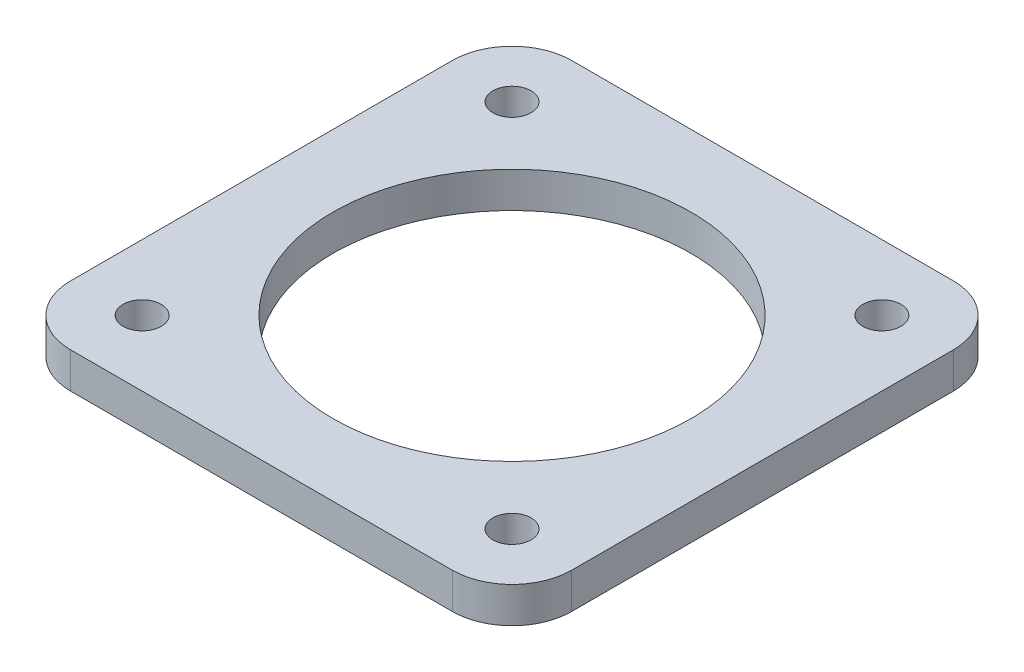
ISO-10303-21;
HEADER;
FILE_DESCRIPTION(('STEP AP214'),'2;1');
FILE_NAME('part.step','',(''),(''),'','','');
FILE_SCHEMA(('AUTOMOTIVE_DESIGN { 1 0 10303 214 1 1 1 1 }'));
ENDSEC;
DATA;
#1=APPLICATION_CONTEXT('core data for automotive mechanical design processes');
#2=APPLICATION_PROTOCOL_DEFINITION('international standard','automotive_design',2000,#1);
#3=PRODUCT_CONTEXT('',#1,'mechanical');
#4=PRODUCT('Part','Part','',(#3));
#5=PRODUCT_RELATED_PRODUCT_CATEGORY('part','',(#4));
#6=PRODUCT_DEFINITION_FORMATION('','',#4);
#7=PRODUCT_DEFINITION_CONTEXT('part definition',#1,'design');
#8=PRODUCT_DEFINITION('design','',#6,#7);
#9=PRODUCT_DEFINITION_SHAPE('','',#8);
#10=(LENGTH_UNIT() NAMED_UNIT(*) SI_UNIT(.MILLI.,.METRE.));
#11=(NAMED_UNIT(*) PLANE_ANGLE_UNIT() SI_UNIT($,.RADIAN.));
#12=(NAMED_UNIT(*) SI_UNIT($,.STERADIAN.) SOLID_ANGLE_UNIT());
#13=UNCERTAINTY_MEASURE_WITH_UNIT(LENGTH_MEASURE(1.E-05),#10,'distance_accuracy_value','');
#14=(GEOMETRIC_REPRESENTATION_CONTEXT(3) GLOBAL_UNCERTAINTY_ASSIGNED_CONTEXT((#13)) GLOBAL_UNIT_ASSIGNED_CONTEXT((#10,
#11,#12)) REPRESENTATION_CONTEXT('',''));
#15=CARTESIAN_POINT('',(0.,0.,0.));
#16=DIRECTION('',(0.,0.,1.));
#17=DIRECTION('',(1.,0.,0.));
#18=AXIS2_PLACEMENT_3D('',#15,#16,#17);
#19=CARTESIAN_POINT('',(0.,3.,21.));
#20=DIRECTION('',(0.,0.,-1.));
#21=DIRECTION('',(-1.,0.,0.));
#22=AXIS2_PLACEMENT_3D('',#19,#20,#21);
#23=PLANE('',#22);
#24=DIRECTION('',(1.,0.,0.));
#25=VECTOR('',#24,1.);
#26=CARTESIAN_POINT('',(0.,0.,21.));
#27=LINE('',#26,#25);
#28=CARTESIAN_POINT('',(-16.,0.,21.));
#29=VERTEX_POINT('',#28);
#30=CARTESIAN_POINT('',(16.,0.,21.));
#31=VERTEX_POINT('',#30);
#32=EDGE_CURVE('E189',#29,#31,#27,.T.);
#33=ORIENTED_EDGE('',*,*,#32,.T.);
#34=DIRECTION('',(0.,-1.,0.));
#35=VECTOR('',#34,1.);
#36=CARTESIAN_POINT('',(16.,3.,21.));
#37=LINE('',#36,#35);
#38=CARTESIAN_POINT('',(16.,3.,21.));
#39=VERTEX_POINT('',#38);
#40=EDGE_CURVE('E174',#31,#39,#37,.F.);
#41=ORIENTED_EDGE('',*,*,#40,.T.);
#42=DIRECTION('',(1.,0.,0.));
#43=VECTOR('',#42,1.);
#44=CARTESIAN_POINT('',(0.,3.,21.));
#45=LINE('',#44,#43);
#46=CARTESIAN_POINT('',(-16.,3.,21.));
#47=VERTEX_POINT('',#46);
#48=EDGE_CURVE('E191',#47,#39,#45,.T.);
#49=ORIENTED_EDGE('',*,*,#48,.F.);
#50=DIRECTION('',(0.,-1.,0.));
#51=VECTOR('',#50,1.);
#52=CARTESIAN_POINT('',(-16.,0.,21.));
#53=LINE('',#52,#51);
#54=EDGE_CURVE('E170',#47,#29,#53,.T.);
#55=ORIENTED_EDGE('',*,*,#54,.T.);
#56=EDGE_LOOP('',(#33,#41,#49,#55));
#57=FACE_BOUND('',#56,.T.);
#58=ADVANCED_FACE('F46',(#57),#23,.F.);
#59=CARTESIAN_POINT('',(21.,3.,0.));
#60=DIRECTION('',(-1.,0.,0.));
#61=DIRECTION('',(0.,0.,1.));
#62=AXIS2_PLACEMENT_3D('',#59,#60,#61);
#63=PLANE('',#62);
#64=DIRECTION('',(0.,0.,-1.));
#65=VECTOR('',#64,1.);
#66=CARTESIAN_POINT('',(21.,0.,0.));
#67=LINE('',#66,#65);
#68=CARTESIAN_POINT('',(21.,0.,16.));
#69=VERTEX_POINT('',#68);
#70=CARTESIAN_POINT('',(21.,0.,-16.));
#71=VERTEX_POINT('',#70);
#72=EDGE_CURVE('E132',#69,#71,#67,.T.);
#73=ORIENTED_EDGE('',*,*,#72,.T.);
#74=DIRECTION('',(0.,-1.,0.));
#75=VECTOR('',#74,1.);
#76=CARTESIAN_POINT('',(21.,3.,-16.));
#77=LINE('',#76,#75);
#78=CARTESIAN_POINT('',(21.,3.,-16.));
#79=VERTEX_POINT('',#78);
#80=EDGE_CURVE('E156',#71,#79,#77,.F.);
#81=ORIENTED_EDGE('',*,*,#80,.T.);
#82=DIRECTION('',(0.,0.,-1.));
#83=VECTOR('',#82,1.);
#84=CARTESIAN_POINT('',(21.,3.,0.));
#85=LINE('',#84,#83);
#86=CARTESIAN_POINT('',(21.,3.,16.));
#87=VERTEX_POINT('',#86);
#88=EDGE_CURVE('E218',#87,#79,#85,.T.);
#89=ORIENTED_EDGE('',*,*,#88,.F.);
#90=DIRECTION('',(0.,-1.,0.));
#91=VECTOR('',#90,1.);
#92=CARTESIAN_POINT('',(21.,3.,16.));
#93=LINE('',#92,#91);
#94=EDGE_CURVE('E152',#87,#69,#93,.T.);
#95=ORIENTED_EDGE('',*,*,#94,.T.);
#96=EDGE_LOOP('',(#73,#81,#89,#95));
#97=FACE_BOUND('',#96,.T.);
#98=ADVANCED_FACE('F281',(#97),#63,.F.);
#99=CARTESIAN_POINT('',(0.,3.,-21.));
#100=DIRECTION('',(0.,0.,-1.));
#101=DIRECTION('',(-1.,0.,0.));
#102=AXIS2_PLACEMENT_3D('',#99,#100,#101);
#103=PLANE('',#102);
#104=DIRECTION('',(1.,0.,0.));
#105=VECTOR('',#104,1.);
#106=CARTESIAN_POINT('',(0.,3.,-21.));
#107=LINE('',#106,#105);
#108=CARTESIAN_POINT('',(-16.,3.,-21.));
#109=VERTEX_POINT('',#108);
#110=CARTESIAN_POINT('',(16.,3.,-21.));
#111=VERTEX_POINT('',#110);
#112=EDGE_CURVE('E140',#109,#111,#107,.T.);
#113=ORIENTED_EDGE('',*,*,#112,.T.);
#114=DIRECTION('',(0.,-1.,0.));
#115=VECTOR('',#114,1.);
#116=CARTESIAN_POINT('',(16.,0.,-21.));
#117=LINE('',#116,#115);
#118=CARTESIAN_POINT('',(16.,0.,-21.));
#119=VERTEX_POINT('',#118);
#120=EDGE_CURVE('E123',#111,#119,#117,.T.);
#121=ORIENTED_EDGE('',*,*,#120,.T.);
#122=DIRECTION('',(1.,0.,0.));
#123=VECTOR('',#122,1.);
#124=CARTESIAN_POINT('',(0.,0.,-21.));
#125=LINE('',#124,#123);
#126=CARTESIAN_POINT('',(-16.,0.,-21.));
#127=VERTEX_POINT('',#126);
#128=EDGE_CURVE('E115',#127,#119,#125,.T.);
#129=ORIENTED_EDGE('',*,*,#128,.F.);
#130=DIRECTION('',(0.,-1.,0.));
#131=VECTOR('',#130,1.);
#132=CARTESIAN_POINT('',(-16.,3.,-21.));
#133=LINE('',#132,#131);
#134=EDGE_CURVE('E129',#127,#109,#133,.F.);
#135=ORIENTED_EDGE('',*,*,#134,.T.);
#136=EDGE_LOOP('',(#113,#121,#129,#135));
#137=FACE_BOUND('',#136,.T.);
#138=ADVANCED_FACE('F128',(#137),#103,.T.);
#139=CARTESIAN_POINT('',(-15.5,3.,-15.5));
#140=DIRECTION('',(0.,-1.,0.));
#141=DIRECTION('',(0.,0.,-1.));
#142=AXIS2_PLACEMENT_3D('',#139,#140,#141);
#143=CYLINDRICAL_SURFACE('',#142,1.6);
#144=CARTESIAN_POINT('',(-15.5,3.,-15.5));
#145=DIRECTION('',(0.,1.,0.));
#146=DIRECTION('',(0.,0.,1.));
#147=AXIS2_PLACEMENT_3D('',#144,#145,#146);
#148=CIRCLE('',#147,1.6);
#149=CARTESIAN_POINT('',(-15.5,3.,-13.9));
#150=VERTEX_POINT('',#149);
#151=EDGE_CURVE('E223',#150,#150,#148,.T.);
#152=ORIENTED_EDGE('',*,*,#151,.T.);
#153=EDGE_LOOP('',(#152));
#154=FACE_BOUND('',#153,.T.);
#155=CARTESIAN_POINT('',(-15.5,0.,-15.5));
#156=DIRECTION('',(0.,1.,0.));
#157=DIRECTION('',(0.,0.,1.));
#158=AXIS2_PLACEMENT_3D('',#155,#156,#157);
#159=CIRCLE('',#158,1.6);
#160=CARTESIAN_POINT('',(-15.5,0.,-13.9));
#161=VERTEX_POINT('',#160);
#162=EDGE_CURVE('E194',#161,#161,#159,.T.);
#163=ORIENTED_EDGE('',*,*,#162,.F.);
#164=EDGE_LOOP('',(#163));
#165=FACE_BOUND('',#164,.T.);
#166=ADVANCED_FACE('F267',(#154,#165),#143,.F.);
#167=CARTESIAN_POINT('',(-15.5000000000002,3.,15.4999999999998));
#168=DIRECTION('',(0.,-1.,0.));
#169=DIRECTION('',(0.,0.,-1.));
#170=AXIS2_PLACEMENT_3D('',#167,#168,#169);
#171=CYLINDRICAL_SURFACE('',#170,1.6);
#172=CARTESIAN_POINT('',(-15.5000000000002,3.,15.4999999999998));
#173=DIRECTION('',(0.,1.,0.));
#174=DIRECTION('',(0.,0.,1.));
#175=AXIS2_PLACEMENT_3D('',#172,#173,#174);
#176=CIRCLE('',#175,1.6);
#177=CARTESIAN_POINT('',(-15.5000000000002,3.,17.0999999999998));
#178=VERTEX_POINT('',#177);
#179=EDGE_CURVE('E227',#178,#178,#176,.T.);
#180=ORIENTED_EDGE('',*,*,#179,.T.);
#181=EDGE_LOOP('',(#180));
#182=FACE_BOUND('',#181,.T.);
#183=CARTESIAN_POINT('',(-15.5000000000002,0.,15.4999999999998));
#184=DIRECTION('',(0.,1.,0.));
#185=DIRECTION('',(0.,0.,1.));
#186=AXIS2_PLACEMENT_3D('',#183,#184,#185);
#187=CIRCLE('',#186,1.6);
#188=CARTESIAN_POINT('',(-15.5000000000002,0.,17.0999999999998));
#189=VERTEX_POINT('',#188);
#190=EDGE_CURVE('E201',#189,#189,#187,.T.);
#191=ORIENTED_EDGE('',*,*,#190,.F.);
#192=EDGE_LOOP('',(#191));
#193=FACE_BOUND('',#192,.T.);
#194=ADVANCED_FACE('F270',(#182,#193),#171,.F.);
#195=CARTESIAN_POINT('',(15.5000000000001,3.,-15.4999999999999));
#196=DIRECTION('',(0.,-1.,0.));
#197=DIRECTION('',(0.,0.,-1.));
#198=AXIS2_PLACEMENT_3D('',#195,#196,#197);
#199=CYLINDRICAL_SURFACE('',#198,1.6);
#200=CARTESIAN_POINT('',(15.5000000000001,3.,-15.4999999999999));
#201=DIRECTION('',(0.,1.,0.));
#202=DIRECTION('',(0.,0.,1.));
#203=AXIS2_PLACEMENT_3D('',#200,#201,#202);
#204=CIRCLE('',#203,1.6);
#205=CARTESIAN_POINT('',(15.5000000000001,3.,-13.8999999999999));
#206=VERTEX_POINT('',#205);
#207=EDGE_CURVE('E231',#206,#206,#204,.T.);
#208=ORIENTED_EDGE('',*,*,#207,.T.);
#209=EDGE_LOOP('',(#208));
#210=FACE_BOUND('',#209,.T.);
#211=CARTESIAN_POINT('',(15.5000000000001,0.,-15.4999999999999));
#212=DIRECTION('',(0.,1.,0.));
#213=DIRECTION('',(0.,0.,1.));
#214=AXIS2_PLACEMENT_3D('',#211,#212,#213);
#215=CIRCLE('',#214,1.6);
#216=CARTESIAN_POINT('',(15.5000000000001,0.,-13.8999999999999));
#217=VERTEX_POINT('',#216);
#218=EDGE_CURVE('E207',#217,#217,#215,.T.);
#219=ORIENTED_EDGE('',*,*,#218,.F.);
#220=EDGE_LOOP('',(#219));
#221=FACE_BOUND('',#220,.T.);
#222=ADVANCED_FACE('F292',(#210,#221),#199,.F.);
#223=CARTESIAN_POINT('',(15.4999999999999,3.,15.5000000000001));
#224=DIRECTION('',(0.,-1.,0.));
#225=DIRECTION('',(0.,0.,-1.));
#226=AXIS2_PLACEMENT_3D('',#223,#224,#225);
#227=CYLINDRICAL_SURFACE('',#226,1.6);
#228=CARTESIAN_POINT('',(15.4999999999999,3.,15.5000000000001));
#229=DIRECTION('',(0.,1.,0.));
#230=DIRECTION('',(0.,0.,1.));
#231=AXIS2_PLACEMENT_3D('',#228,#229,#230);
#232=CIRCLE('',#231,1.6);
#233=CARTESIAN_POINT('',(15.4999999999999,3.,17.1000000000001));
#234=VERTEX_POINT('',#233);
#235=EDGE_CURVE('E235',#234,#234,#232,.T.);
#236=ORIENTED_EDGE('',*,*,#235,.T.);
#237=EDGE_LOOP('',(#236));
#238=FACE_BOUND('',#237,.T.);
#239=CARTESIAN_POINT('',(15.4999999999999,0.,15.5000000000001));
#240=DIRECTION('',(0.,1.,0.));
#241=DIRECTION('',(0.,0.,1.));
#242=AXIS2_PLACEMENT_3D('',#239,#240,#241);
#243=CIRCLE('',#242,1.6);
#244=CARTESIAN_POINT('',(15.4999999999999,0.,17.1000000000001));
#245=VERTEX_POINT('',#244);
#246=EDGE_CURVE('E211',#245,#245,#243,.T.);
#247=ORIENTED_EDGE('',*,*,#246,.F.);
#248=EDGE_LOOP('',(#247));
#249=FACE_BOUND('',#248,.T.);
#250=ADVANCED_FACE('F296',(#238,#249),#227,.F.);
#251=CARTESIAN_POINT('',(-21.,3.,0.));
#252=DIRECTION('',(-1.,0.,0.));
#253=DIRECTION('',(0.,0.,1.));
#254=AXIS2_PLACEMENT_3D('',#251,#252,#253);
#255=PLANE('',#254);
#256=DIRECTION('',(0.,0.,-1.));
#257=VECTOR('',#256,1.);
#258=CARTESIAN_POINT('',(-21.,0.,0.));
#259=LINE('',#258,#257);
#260=CARTESIAN_POINT('',(-21.,0.,16.));
#261=VERTEX_POINT('',#260);
#262=CARTESIAN_POINT('',(-21.,0.,-16.));
#263=VERTEX_POINT('',#262);
#264=EDGE_CURVE('E116',#261,#263,#259,.T.);
#265=ORIENTED_EDGE('',*,*,#264,.F.);
#266=DIRECTION('',(0.,-1.,0.));
#267=VECTOR('',#266,1.);
#268=CARTESIAN_POINT('',(-21.,3.,16.));
#269=LINE('',#268,#267);
#270=CARTESIAN_POINT('',(-21.,3.,16.));
#271=VERTEX_POINT('',#270);
#272=EDGE_CURVE('E11',#261,#271,#269,.F.);
#273=ORIENTED_EDGE('',*,*,#272,.T.);
#274=DIRECTION('',(0.,0.,-1.));
#275=VECTOR('',#274,1.);
#276=CARTESIAN_POINT('',(-21.,3.,0.));
#277=LINE('',#276,#275);
#278=CARTESIAN_POINT('',(-21.,3.,-16.));
#279=VERTEX_POINT('',#278);
#280=EDGE_CURVE('E135',#271,#279,#277,.T.);
#281=ORIENTED_EDGE('',*,*,#280,.T.);
#282=DIRECTION('',(0.,-1.,0.));
#283=VECTOR('',#282,1.);
#284=CARTESIAN_POINT('',(-21.,3.,-16.));
#285=LINE('',#284,#283);
#286=EDGE_CURVE('E55',#279,#263,#285,.T.);
#287=ORIENTED_EDGE('',*,*,#286,.T.);
#288=EDGE_LOOP('',(#265,#273,#281,#287));
#289=FACE_BOUND('',#288,.T.);
#290=ADVANCED_FACE('F177',(#289),#255,.T.);
#291=CARTESIAN_POINT('',(0.,3.,0.));
#292=DIRECTION('',(0.,1.,0.));
#293=DIRECTION('',(0.,0.,1.));
#294=AXIS2_PLACEMENT_3D('',#291,#292,#293);
#295=PLANE('',#294);
#296=CARTESIAN_POINT('',(0.,3.,0.));
#297=DIRECTION('',(0.,1.,0.));
#298=DIRECTION('',(0.,0.,1.));
#299=AXIS2_PLACEMENT_3D('',#296,#297,#298);
#300=CIRCLE('',#299,15.);
#301=CARTESIAN_POINT('',(0.,3.,15.));
#302=VERTEX_POINT('',#301);
#303=EDGE_CURVE('E239',#302,#302,#300,.T.);
#304=ORIENTED_EDGE('',*,*,#303,.F.);
#305=EDGE_LOOP('',(#304));
#306=FACE_BOUND('',#305,.T.);
#307=ORIENTED_EDGE('',*,*,#235,.F.);
#308=EDGE_LOOP('',(#307));
#309=FACE_BOUND('',#308,.T.);
#310=ORIENTED_EDGE('',*,*,#207,.F.);
#311=EDGE_LOOP('',(#310));
#312=FACE_BOUND('',#311,.T.);
#313=ORIENTED_EDGE('',*,*,#179,.F.);
#314=EDGE_LOOP('',(#313));
#315=FACE_BOUND('',#314,.T.);
#316=ORIENTED_EDGE('',*,*,#151,.F.);
#317=EDGE_LOOP('',(#316));
#318=FACE_BOUND('',#317,.T.);
#319=ORIENTED_EDGE('',*,*,#88,.T.);
#320=CARTESIAN_POINT('',(16.,3.,-16.));
#321=DIRECTION('',(0.,1.,0.));
#322=DIRECTION('',(0.,0.,1.));
#323=AXIS2_PLACEMENT_3D('',#320,#321,#322);
#324=CIRCLE('',#323,5.);
#325=EDGE_CURVE('E167',#79,#111,#324,.T.);
#326=ORIENTED_EDGE('',*,*,#325,.T.);
#327=ORIENTED_EDGE('',*,*,#112,.F.);
#328=CARTESIAN_POINT('',(-16.,3.,-16.));
#329=DIRECTION('',(0.,1.,0.));
#330=DIRECTION('',(0.,0.,1.));
#331=AXIS2_PLACEMENT_3D('',#328,#329,#330);
#332=CIRCLE('',#331,5.);
#333=EDGE_CURVE('E62',#109,#279,#332,.T.);
#334=ORIENTED_EDGE('',*,*,#333,.T.);
#335=ORIENTED_EDGE('',*,*,#280,.F.);
#336=CARTESIAN_POINT('',(-16.,3.,16.));
#337=DIRECTION('',(0.,1.,0.));
#338=DIRECTION('',(0.,0.,1.));
#339=AXIS2_PLACEMENT_3D('',#336,#337,#338);
#340=CIRCLE('',#339,5.);
#341=EDGE_CURVE('E161',#271,#47,#340,.T.);
#342=ORIENTED_EDGE('',*,*,#341,.T.);
#343=ORIENTED_EDGE('',*,*,#48,.T.);
#344=CARTESIAN_POINT('',(16.,3.,16.));
#345=DIRECTION('',(0.,1.,0.));
#346=DIRECTION('',(0.,0.,1.));
#347=AXIS2_PLACEMENT_3D('',#344,#345,#346);
#348=CIRCLE('',#347,5.);
#349=EDGE_CURVE('E164',#39,#87,#348,.T.);
#350=ORIENTED_EDGE('',*,*,#349,.T.);
#351=EDGE_LOOP('',(#319,#326,#327,#334,#335,#342,#343,#350));
#352=FACE_BOUND('',#351,.T.);
#353=ADVANCED_FACE('F180',(#306,#309,#312,#315,#318,#352),#295,.T.);
#354=CARTESIAN_POINT('',(0.,0.,0.));
#355=DIRECTION('',(0.,1.,0.));
#356=DIRECTION('',(0.,0.,1.));
#357=AXIS2_PLACEMENT_3D('',#354,#355,#356);
#358=PLANE('',#357);
#359=CARTESIAN_POINT('',(0.,0.,0.));
#360=DIRECTION('',(0.,1.,0.));
#361=DIRECTION('',(0.,0.,1.));
#362=AXIS2_PLACEMENT_3D('',#359,#360,#361);
#363=CIRCLE('',#362,15.);
#364=CARTESIAN_POINT('',(0.,0.,15.));
#365=VERTEX_POINT('',#364);
#366=EDGE_CURVE('E214',#365,#365,#363,.T.);
#367=ORIENTED_EDGE('',*,*,#366,.T.);
#368=EDGE_LOOP('',(#367));
#369=FACE_BOUND('',#368,.T.);
#370=ORIENTED_EDGE('',*,*,#246,.T.);
#371=EDGE_LOOP('',(#370));
#372=FACE_BOUND('',#371,.T.);
#373=ORIENTED_EDGE('',*,*,#218,.T.);
#374=EDGE_LOOP('',(#373));
#375=FACE_BOUND('',#374,.T.);
#376=ORIENTED_EDGE('',*,*,#190,.T.);
#377=EDGE_LOOP('',(#376));
#378=FACE_BOUND('',#377,.T.);
#379=ORIENTED_EDGE('',*,*,#162,.T.);
#380=EDGE_LOOP('',(#379));
#381=FACE_BOUND('',#380,.T.);
#382=ORIENTED_EDGE('',*,*,#128,.T.);
#383=CARTESIAN_POINT('',(16.,0.,-16.));
#384=DIRECTION('',(0.,1.,0.));
#385=DIRECTION('',(0.,0.,1.));
#386=AXIS2_PLACEMENT_3D('',#383,#384,#385);
#387=CIRCLE('',#386,5.);
#388=EDGE_CURVE('E149',#119,#71,#387,.F.);
#389=ORIENTED_EDGE('',*,*,#388,.T.);
#390=ORIENTED_EDGE('',*,*,#72,.F.);
#391=CARTESIAN_POINT('',(16.,0.,16.));
#392=DIRECTION('',(0.,1.,0.));
#393=DIRECTION('',(0.,0.,1.));
#394=AXIS2_PLACEMENT_3D('',#391,#392,#393);
#395=CIRCLE('',#394,5.);
#396=EDGE_CURVE('E146',#69,#31,#395,.F.);
#397=ORIENTED_EDGE('',*,*,#396,.T.);
#398=ORIENTED_EDGE('',*,*,#32,.F.);
#399=CARTESIAN_POINT('',(-16.,0.,16.));
#400=DIRECTION('',(0.,1.,0.));
#401=DIRECTION('',(0.,0.,1.));
#402=AXIS2_PLACEMENT_3D('',#399,#400,#401);
#403=CIRCLE('',#402,5.);
#404=EDGE_CURVE('E122',#29,#261,#403,.F.);
#405=ORIENTED_EDGE('',*,*,#404,.T.);
#406=ORIENTED_EDGE('',*,*,#264,.T.);
#407=CARTESIAN_POINT('',(-16.,0.,-16.));
#408=DIRECTION('',(0.,1.,0.));
#409=DIRECTION('',(0.,0.,1.));
#410=AXIS2_PLACEMENT_3D('',#407,#408,#409);
#411=CIRCLE('',#410,5.);
#412=EDGE_CURVE('E112',#263,#127,#411,.F.);
#413=ORIENTED_EDGE('',*,*,#412,.T.);
#414=EDGE_LOOP('',(#382,#389,#390,#397,#398,#405,#406,#413));
#415=FACE_BOUND('',#414,.T.);
#416=ADVANCED_FACE('F114',(#369,#372,#375,#378,#381,#415),#358,.F.);
#417=CARTESIAN_POINT('',(0.,0.,0.));
#418=DIRECTION('',(0.,1.,0.));
#419=DIRECTION('',(0.,0.,1.));
#420=AXIS2_PLACEMENT_3D('',#417,#418,#419);
#421=CYLINDRICAL_SURFACE('',#420,15.);
#422=ORIENTED_EDGE('',*,*,#366,.F.);
#423=EDGE_LOOP('',(#422));
#424=FACE_BOUND('',#423,.T.);
#425=ORIENTED_EDGE('',*,*,#303,.T.);
#426=EDGE_LOOP('',(#425));
#427=FACE_BOUND('',#426,.T.);
#428=ADVANCED_FACE('F249',(#424,#427),#421,.F.);
#429=CARTESIAN_POINT('',(16.,3.,-16.));
#430=DIRECTION('',(0.,1.,0.));
#431=DIRECTION('',(0.,0.,1.));
#432=AXIS2_PLACEMENT_3D('',#429,#430,#431);
#433=CYLINDRICAL_SURFACE('',#432,5.);
#434=ORIENTED_EDGE('',*,*,#325,.F.);
#435=ORIENTED_EDGE('',*,*,#80,.F.);
#436=ORIENTED_EDGE('',*,*,#388,.F.);
#437=ORIENTED_EDGE('',*,*,#120,.F.);
#438=EDGE_LOOP('',(#434,#435,#436,#437));
#439=FACE_BOUND('',#438,.T.);
#440=ADVANCED_FACE('F252',(#439),#433,.T.);
#441=CARTESIAN_POINT('',(16.,3.,16.));
#442=DIRECTION('',(0.,-1.,0.));
#443=DIRECTION('',(0.,0.,-1.));
#444=AXIS2_PLACEMENT_3D('',#441,#442,#443);
#445=CYLINDRICAL_SURFACE('',#444,5.);
#446=ORIENTED_EDGE('',*,*,#349,.F.);
#447=ORIENTED_EDGE('',*,*,#40,.F.);
#448=ORIENTED_EDGE('',*,*,#396,.F.);
#449=ORIENTED_EDGE('',*,*,#94,.F.);
#450=EDGE_LOOP('',(#446,#447,#448,#449));
#451=FACE_BOUND('',#450,.T.);
#452=ADVANCED_FACE('F302',(#451),#445,.T.);
#453=CARTESIAN_POINT('',(-16.,3.,16.));
#454=DIRECTION('',(0.,1.,0.));
#455=DIRECTION('',(0.,0.,1.));
#456=AXIS2_PLACEMENT_3D('',#453,#454,#455);
#457=CYLINDRICAL_SURFACE('',#456,5.);
#458=ORIENTED_EDGE('',*,*,#341,.F.);
#459=ORIENTED_EDGE('',*,*,#272,.F.);
#460=ORIENTED_EDGE('',*,*,#404,.F.);
#461=ORIENTED_EDGE('',*,*,#54,.F.);
#462=EDGE_LOOP('',(#458,#459,#460,#461));
#463=FACE_BOUND('',#462,.T.);
#464=ADVANCED_FACE('F185',(#463),#457,.T.);
#465=CARTESIAN_POINT('',(-16.,3.,-16.));
#466=DIRECTION('',(0.,-1.,0.));
#467=DIRECTION('',(0.,0.,-1.));
#468=AXIS2_PLACEMENT_3D('',#465,#466,#467);
#469=CYLINDRICAL_SURFACE('',#468,5.);
#470=ORIENTED_EDGE('',*,*,#333,.F.);
#471=ORIENTED_EDGE('',*,*,#134,.F.);
#472=ORIENTED_EDGE('',*,*,#412,.F.);
#473=ORIENTED_EDGE('',*,*,#286,.F.);
#474=EDGE_LOOP('',(#470,#471,#472,#473));
#475=FACE_BOUND('',#474,.T.);
#476=ADVANCED_FACE('F48',(#475),#469,.T.);
#477=CLOSED_SHELL('',(#58,#98,#138,#166,#194,#222,#250,#290,#353,#416,#428,#440,#452,#464,#476));
#478=MANIFOLD_SOLID_BREP('B2',#477);
#479=ADVANCED_BREP_SHAPE_REPRESENTATION('',(#18,#478),#14);
#480=SHAPE_DEFINITION_REPRESENTATION(#9,#479);
ENDSEC;
END-ISO-10303-21;
